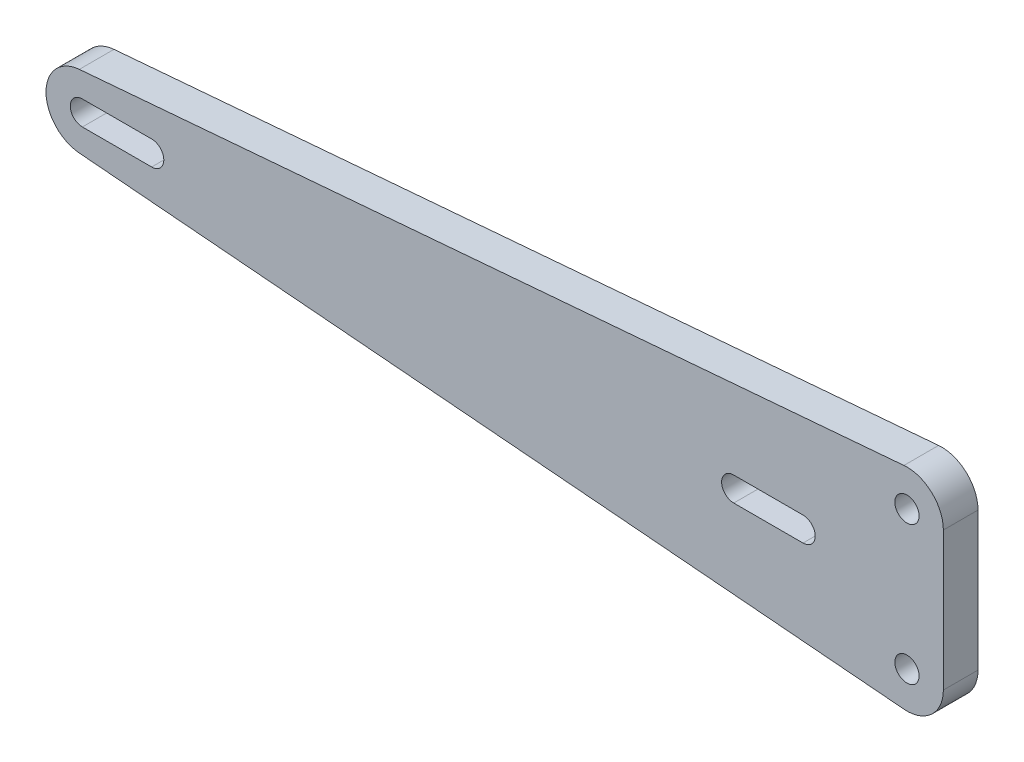
ISO-10303-21;
HEADER;
FILE_DESCRIPTION(('STEP AP214'),'2;1');
FILE_NAME('part.step','',(''),(''),'','','');
FILE_SCHEMA(('AUTOMOTIVE_DESIGN { 1 0 10303 214 1 1 1 1 }'));
ENDSEC;
DATA;
#1=APPLICATION_CONTEXT('core data for automotive mechanical design processes');
#2=APPLICATION_PROTOCOL_DEFINITION('international standard','automotive_design',2000,#1);
#3=PRODUCT_CONTEXT('',#1,'mechanical');
#4=PRODUCT('Part','Part','',(#3));
#5=PRODUCT_RELATED_PRODUCT_CATEGORY('part','',(#4));
#6=PRODUCT_DEFINITION_FORMATION('','',#4);
#7=PRODUCT_DEFINITION_CONTEXT('part definition',#1,'design');
#8=PRODUCT_DEFINITION('design','',#6,#7);
#9=PRODUCT_DEFINITION_SHAPE('','',#8);
#10=(LENGTH_UNIT() NAMED_UNIT(*) SI_UNIT(.MILLI.,.METRE.));
#11=(NAMED_UNIT(*) PLANE_ANGLE_UNIT() SI_UNIT($,.RADIAN.));
#12=(NAMED_UNIT(*) SI_UNIT($,.STERADIAN.) SOLID_ANGLE_UNIT());
#13=UNCERTAINTY_MEASURE_WITH_UNIT(LENGTH_MEASURE(1.E-05),#10,'distance_accuracy_value','');
#14=(GEOMETRIC_REPRESENTATION_CONTEXT(3) GLOBAL_UNCERTAINTY_ASSIGNED_CONTEXT((#13)) GLOBAL_UNIT_ASSIGNED_CONTEXT((#10,
#11,#12)) REPRESENTATION_CONTEXT('',''));
#15=CARTESIAN_POINT('',(0.,0.,0.));
#16=DIRECTION('',(0.,0.,1.));
#17=DIRECTION('',(1.,0.,0.));
#18=AXIS2_PLACEMENT_3D('',#15,#16,#17);
#19=CARTESIAN_POINT('',(-57.,0.,5.));
#20=DIRECTION('',(0.,0.,1.));
#21=DIRECTION('',(1.,0.,0.));
#22=AXIS2_PLACEMENT_3D('',#19,#20,#21);
#23=PLANE('',#22);
#24=CARTESIAN_POINT('',(62.,-10.,5.));
#25=DIRECTION('',(0.,0.,1.));
#26=DIRECTION('',(1.,0.,0.));
#27=AXIS2_PLACEMENT_3D('',#24,#25,#26);
#28=CIRCLE('',#27,1.75);
#29=CARTESIAN_POINT('',(63.75,-10.,5.));
#30=VERTEX_POINT('',#29);
#31=EDGE_CURVE('E162',#30,#30,#28,.T.);
#32=ORIENTED_EDGE('',*,*,#31,.F.);
#33=EDGE_LOOP('',(#32));
#34=FACE_BOUND('',#33,.T.);
#35=CARTESIAN_POINT('',(-57.,0.,5.));
#36=DIRECTION('',(0.,0.,1.));
#37=DIRECTION('',(1.,0.,0.));
#38=AXIS2_PLACEMENT_3D('',#35,#36,#37);
#39=CIRCLE('',#38,5.25);
#40=CARTESIAN_POINT('',(-57.4396269558596,5.23156077472886,5.));
#41=VERTEX_POINT('',#40);
#42=CARTESIAN_POINT('',(-57.4396269558596,-5.23156077472886,5.));
#43=VERTEX_POINT('',#42);
#44=EDGE_CURVE('E203',#41,#43,#39,.T.);
#45=ORIENTED_EDGE('',*,*,#44,.T.);
#46=DIRECTION('',(0.996487766615021,-0.0837384677827749,0.));
#47=VECTOR('',#46,1.);
#48=CARTESIAN_POINT('',(-57.4396269558596,-5.23156077472886,5.));
#49=LINE('',#48,#47);
#50=CARTESIAN_POINT('',(61.5603730441404,-15.2315607747289,5.));
#51=VERTEX_POINT('',#50);
#52=EDGE_CURVE('E206',#43,#51,#49,.T.);
#53=ORIENTED_EDGE('',*,*,#52,.T.);
#54=CARTESIAN_POINT('',(62.,-10.,5.));
#55=DIRECTION('',(0.,0.,1.));
#56=DIRECTION('',(1.,0.,0.));
#57=AXIS2_PLACEMENT_3D('',#54,#55,#56);
#58=CIRCLE('',#57,5.25);
#59=CARTESIAN_POINT('',(67.25,-10.,5.));
#60=VERTEX_POINT('',#59);
#61=EDGE_CURVE('E209',#51,#60,#58,.T.);
#62=ORIENTED_EDGE('',*,*,#61,.T.);
#63=DIRECTION('',(0.,1.,0.));
#64=VECTOR('',#63,1.);
#65=CARTESIAN_POINT('',(67.25,10.,5.));
#66=LINE('',#65,#64);
#67=CARTESIAN_POINT('',(67.25,10.,5.));
#68=VERTEX_POINT('',#67);
#69=EDGE_CURVE('E211',#60,#68,#66,.T.);
#70=ORIENTED_EDGE('',*,*,#69,.T.);
#71=CARTESIAN_POINT('',(62.,10.,5.));
#72=DIRECTION('',(0.,0.,1.));
#73=DIRECTION('',(1.,0.,0.));
#74=AXIS2_PLACEMENT_3D('',#71,#72,#73);
#75=CIRCLE('',#74,5.25000000000002);
#76=CARTESIAN_POINT('',(61.5603730441404,15.2315607747289,5.));
#77=VERTEX_POINT('',#76);
#78=EDGE_CURVE('E213',#68,#77,#75,.T.);
#79=ORIENTED_EDGE('',*,*,#78,.T.);
#80=DIRECTION('',(-0.996487766615021,-0.0837384677827752,0.));
#81=VECTOR('',#80,1.);
#82=CARTESIAN_POINT('',(-57.4396269558596,5.23156077472886,5.));
#83=LINE('',#82,#81);
#84=EDGE_CURVE('E215',#77,#41,#83,.T.);
#85=ORIENTED_EDGE('',*,*,#84,.T.);
#86=EDGE_LOOP('',(#45,#53,#62,#70,#79,#85));
#87=FACE_BOUND('',#86,.T.);
#88=DIRECTION('',(-1.,0.,0.));
#89=VECTOR('',#88,1.);
#90=CARTESIAN_POINT('',(47.,1.74999999999998,5.));
#91=LINE('',#90,#89);
#92=CARTESIAN_POINT('',(47.,1.74999999999998,5.));
#93=VERTEX_POINT('',#92);
#94=CARTESIAN_POINT('',(37.,1.74999999999998,5.));
#95=VERTEX_POINT('',#94);
#96=EDGE_CURVE('E174',#93,#95,#91,.T.);
#97=ORIENTED_EDGE('',*,*,#96,.F.);
#98=CARTESIAN_POINT('',(47.,0.,5.));
#99=DIRECTION('',(0.,0.,1.));
#100=DIRECTION('',(1.,0.,0.));
#101=AXIS2_PLACEMENT_3D('',#98,#99,#100);
#102=CIRCLE('',#101,1.74999999999998);
#103=CARTESIAN_POINT('',(47.,-1.74999999999998,5.));
#104=VERTEX_POINT('',#103);
#105=EDGE_CURVE('E172',#104,#93,#102,.T.);
#106=ORIENTED_EDGE('',*,*,#105,.F.);
#107=DIRECTION('',(1.,0.,0.));
#108=VECTOR('',#107,1.);
#109=CARTESIAN_POINT('',(47.,-1.74999999999998,5.));
#110=LINE('',#109,#108);
#111=CARTESIAN_POINT('',(37.,-1.74999999999998,5.));
#112=VERTEX_POINT('',#111);
#113=EDGE_CURVE('E180',#112,#104,#110,.T.);
#114=ORIENTED_EDGE('',*,*,#113,.F.);
#115=CARTESIAN_POINT('',(37.,0.,5.));
#116=DIRECTION('',(0.,0.,1.));
#117=DIRECTION('',(1.,0.,0.));
#118=AXIS2_PLACEMENT_3D('',#115,#116,#117);
#119=CIRCLE('',#118,1.74999999999998);
#120=EDGE_CURVE('E177',#95,#112,#119,.T.);
#121=ORIENTED_EDGE('',*,*,#120,.F.);
#122=EDGE_LOOP('',(#97,#106,#114,#121));
#123=FACE_BOUND('',#122,.T.);
#124=DIRECTION('',(-1.,0.,0.));
#125=VECTOR('',#124,1.);
#126=CARTESIAN_POINT('',(-47.,1.74999999999996,5.));
#127=LINE('',#126,#125);
#128=CARTESIAN_POINT('',(-47.,1.74999999999996,5.));
#129=VERTEX_POINT('',#128);
#130=CARTESIAN_POINT('',(-57.,1.74999999999999,5.));
#131=VERTEX_POINT('',#130);
#132=EDGE_CURVE('E141',#129,#131,#127,.T.);
#133=ORIENTED_EDGE('',*,*,#132,.F.);
#134=CARTESIAN_POINT('',(-47.,0.,5.));
#135=DIRECTION('',(0.,0.,1.));
#136=DIRECTION('',(1.,0.,0.));
#137=AXIS2_PLACEMENT_3D('',#134,#135,#136);
#138=CIRCLE('',#137,1.74999999999998);
#139=CARTESIAN_POINT('',(-47.,-1.74999999999999,5.));
#140=VERTEX_POINT('',#139);
#141=EDGE_CURVE('E133',#140,#129,#138,.T.);
#142=ORIENTED_EDGE('',*,*,#141,.F.);
#143=DIRECTION('',(1.,0.,0.));
#144=VECTOR('',#143,1.);
#145=CARTESIAN_POINT('',(-47.,-1.74999999999999,5.));
#146=LINE('',#145,#144);
#147=CARTESIAN_POINT('',(-57.,-1.74999999999999,5.));
#148=VERTEX_POINT('',#147);
#149=EDGE_CURVE('E156',#148,#140,#146,.T.);
#150=ORIENTED_EDGE('',*,*,#149,.F.);
#151=CARTESIAN_POINT('',(-57.,0.,5.));
#152=DIRECTION('',(0.,0.,1.));
#153=DIRECTION('',(1.,0.,0.));
#154=AXIS2_PLACEMENT_3D('',#151,#152,#153);
#155=CIRCLE('',#154,1.74999999999999);
#156=EDGE_CURVE('E154',#131,#148,#155,.T.);
#157=ORIENTED_EDGE('',*,*,#156,.F.);
#158=EDGE_LOOP('',(#133,#142,#150,#157));
#159=FACE_BOUND('',#158,.T.);
#160=CARTESIAN_POINT('',(62.,10.,5.));
#161=DIRECTION('',(0.,0.,1.));
#162=DIRECTION('',(-1.,0.,0.));
#163=AXIS2_PLACEMENT_3D('',#160,#161,#162);
#164=CIRCLE('',#163,1.75);
#165=CARTESIAN_POINT('',(60.25,10.,5.));
#166=VERTEX_POINT('',#165);
#167=EDGE_CURVE('E327',#166,#166,#164,.T.);
#168=ORIENTED_EDGE('',*,*,#167,.F.);
#169=EDGE_LOOP('',(#168));
#170=FACE_BOUND('',#169,.T.);
#171=ADVANCED_FACE('F32',(#34,#87,#123,#159,#170),#23,.T.);
#172=CARTESIAN_POINT('',(-57.,0.,0.));
#173=DIRECTION('',(0.,0.,1.));
#174=DIRECTION('',(1.,0.,0.));
#175=AXIS2_PLACEMENT_3D('',#172,#173,#174);
#176=PLANE('',#175);
#177=CARTESIAN_POINT('',(47.,0.,0.));
#178=DIRECTION('',(0.,0.,1.));
#179=DIRECTION('',(1.,0.,0.));
#180=AXIS2_PLACEMENT_3D('',#177,#178,#179);
#181=CIRCLE('',#180,1.74999999999998);
#182=CARTESIAN_POINT('',(47.,-1.74999999999998,0.));
#183=VERTEX_POINT('',#182);
#184=CARTESIAN_POINT('',(47.,1.74999999999998,0.));
#185=VERTEX_POINT('',#184);
#186=EDGE_CURVE('E149',#183,#185,#181,.T.);
#187=ORIENTED_EDGE('',*,*,#186,.T.);
#188=DIRECTION('',(-1.,0.,0.));
#189=VECTOR('',#188,1.);
#190=CARTESIAN_POINT('',(47.,1.74999999999998,0.));
#191=LINE('',#190,#189);
#192=CARTESIAN_POINT('',(37.,1.74999999999998,0.));
#193=VERTEX_POINT('',#192);
#194=EDGE_CURVE('E185',#185,#193,#191,.T.);
#195=ORIENTED_EDGE('',*,*,#194,.T.);
#196=CARTESIAN_POINT('',(37.,0.,0.));
#197=DIRECTION('',(0.,0.,1.));
#198=DIRECTION('',(1.,0.,0.));
#199=AXIS2_PLACEMENT_3D('',#196,#197,#198);
#200=CIRCLE('',#199,1.74999999999998);
#201=CARTESIAN_POINT('',(37.,-1.74999999999998,0.));
#202=VERTEX_POINT('',#201);
#203=EDGE_CURVE('E188',#193,#202,#200,.T.);
#204=ORIENTED_EDGE('',*,*,#203,.T.);
#205=DIRECTION('',(1.,0.,0.));
#206=VECTOR('',#205,1.);
#207=CARTESIAN_POINT('',(47.,-1.74999999999998,0.));
#208=LINE('',#207,#206);
#209=EDGE_CURVE('E175',#202,#183,#208,.T.);
#210=ORIENTED_EDGE('',*,*,#209,.T.);
#211=EDGE_LOOP('',(#187,#195,#204,#210));
#212=FACE_BOUND('',#211,.T.);
#213=CARTESIAN_POINT('',(-57.,0.,0.));
#214=DIRECTION('',(0.,0.,1.));
#215=DIRECTION('',(1.,0.,0.));
#216=AXIS2_PLACEMENT_3D('',#213,#214,#215);
#217=CIRCLE('',#216,5.25);
#218=CARTESIAN_POINT('',(-57.4396269558596,5.23156077472886,0.));
#219=VERTEX_POINT('',#218);
#220=CARTESIAN_POINT('',(-57.4396269558596,-5.23156077472886,0.));
#221=VERTEX_POINT('',#220);
#222=EDGE_CURVE('E202',#219,#221,#217,.T.);
#223=ORIENTED_EDGE('',*,*,#222,.F.);
#224=DIRECTION('',(-0.996487766615021,-0.0837384677827752,0.));
#225=VECTOR('',#224,1.);
#226=CARTESIAN_POINT('',(-57.4396269558596,5.23156077472886,0.));
#227=LINE('',#226,#225);
#228=CARTESIAN_POINT('',(61.5603730441404,15.2315607747289,0.));
#229=VERTEX_POINT('',#228);
#230=EDGE_CURVE('E207',#229,#219,#227,.T.);
#231=ORIENTED_EDGE('',*,*,#230,.F.);
#232=CARTESIAN_POINT('',(62.,10.,0.));
#233=DIRECTION('',(0.,0.,1.));
#234=DIRECTION('',(1.,0.,0.));
#235=AXIS2_PLACEMENT_3D('',#232,#233,#234);
#236=CIRCLE('',#235,5.25000000000002);
#237=CARTESIAN_POINT('',(67.25,10.,0.));
#238=VERTEX_POINT('',#237);
#239=EDGE_CURVE('E226',#238,#229,#236,.T.);
#240=ORIENTED_EDGE('',*,*,#239,.F.);
#241=DIRECTION('',(0.,1.,0.));
#242=VECTOR('',#241,1.);
#243=CARTESIAN_POINT('',(67.25,10.,0.));
#244=LINE('',#243,#242);
#245=CARTESIAN_POINT('',(67.25,-10.,0.));
#246=VERTEX_POINT('',#245);
#247=EDGE_CURVE('E224',#246,#238,#244,.T.);
#248=ORIENTED_EDGE('',*,*,#247,.F.);
#249=CARTESIAN_POINT('',(62.,-10.,0.));
#250=DIRECTION('',(0.,0.,1.));
#251=DIRECTION('',(1.,0.,0.));
#252=AXIS2_PLACEMENT_3D('',#249,#250,#251);
#253=CIRCLE('',#252,5.25);
#254=CARTESIAN_POINT('',(61.5603730441404,-15.2315607747289,0.));
#255=VERTEX_POINT('',#254);
#256=EDGE_CURVE('E222',#255,#246,#253,.T.);
#257=ORIENTED_EDGE('',*,*,#256,.F.);
#258=DIRECTION('',(0.996487766615021,-0.0837384677827749,0.));
#259=VECTOR('',#258,1.);
#260=CARTESIAN_POINT('',(-57.4396269558596,-5.23156077472886,0.));
#261=LINE('',#260,#259);
#262=EDGE_CURVE('E220',#221,#255,#261,.T.);
#263=ORIENTED_EDGE('',*,*,#262,.F.);
#264=EDGE_LOOP('',(#223,#231,#240,#248,#257,#263));
#265=FACE_BOUND('',#264,.T.);
#266=CARTESIAN_POINT('',(-47.,0.,0.));
#267=DIRECTION('',(0.,0.,1.));
#268=DIRECTION('',(1.,0.,0.));
#269=AXIS2_PLACEMENT_3D('',#266,#267,#268);
#270=CIRCLE('',#269,1.74999999999998);
#271=CARTESIAN_POINT('',(-47.,-1.74999999999999,0.));
#272=VERTEX_POINT('',#271);
#273=CARTESIAN_POINT('',(-47.,1.74999999999996,0.));
#274=VERTEX_POINT('',#273);
#275=EDGE_CURVE('E55',#272,#274,#270,.T.);
#276=ORIENTED_EDGE('',*,*,#275,.T.);
#277=DIRECTION('',(-1.,0.,0.));
#278=VECTOR('',#277,1.);
#279=CARTESIAN_POINT('',(-47.,1.74999999999996,0.));
#280=LINE('',#279,#278);
#281=CARTESIAN_POINT('',(-57.,1.74999999999999,0.));
#282=VERTEX_POINT('',#281);
#283=EDGE_CURVE('E148',#274,#282,#280,.T.);
#284=ORIENTED_EDGE('',*,*,#283,.T.);
#285=CARTESIAN_POINT('',(-57.,0.,0.));
#286=DIRECTION('',(0.,0.,1.));
#287=DIRECTION('',(1.,0.,0.));
#288=AXIS2_PLACEMENT_3D('',#285,#286,#287);
#289=CIRCLE('',#288,1.74999999999999);
#290=CARTESIAN_POINT('',(-57.,-1.74999999999999,0.));
#291=VERTEX_POINT('',#290);
#292=EDGE_CURVE('E164',#282,#291,#289,.T.);
#293=ORIENTED_EDGE('',*,*,#292,.T.);
#294=DIRECTION('',(1.,0.,0.));
#295=VECTOR('',#294,1.);
#296=CARTESIAN_POINT('',(-47.,-1.74999999999999,0.));
#297=LINE('',#296,#295);
#298=EDGE_CURVE('E142',#291,#272,#297,.T.);
#299=ORIENTED_EDGE('',*,*,#298,.T.);
#300=EDGE_LOOP('',(#276,#284,#293,#299));
#301=FACE_BOUND('',#300,.T.);
#302=CARTESIAN_POINT('',(62.,-10.,0.));
#303=DIRECTION('',(0.,0.,1.));
#304=DIRECTION('',(1.,0.,0.));
#305=AXIS2_PLACEMENT_3D('',#302,#303,#304);
#306=CIRCLE('',#305,1.75);
#307=CARTESIAN_POINT('',(63.75,-10.,0.));
#308=VERTEX_POINT('',#307);
#309=EDGE_CURVE('E333',#308,#308,#306,.T.);
#310=ORIENTED_EDGE('',*,*,#309,.T.);
#311=EDGE_LOOP('',(#310));
#312=FACE_BOUND('',#311,.T.);
#313=CARTESIAN_POINT('',(62.,10.,0.));
#314=DIRECTION('',(0.,0.,1.));
#315=DIRECTION('',(-1.,0.,0.));
#316=AXIS2_PLACEMENT_3D('',#313,#314,#315);
#317=CIRCLE('',#316,1.75);
#318=CARTESIAN_POINT('',(60.25,10.,0.));
#319=VERTEX_POINT('',#318);
#320=EDGE_CURVE('E330',#319,#319,#317,.T.);
#321=ORIENTED_EDGE('',*,*,#320,.T.);
#322=EDGE_LOOP('',(#321));
#323=FACE_BOUND('',#322,.T.);
#324=ADVANCED_FACE('F250',(#212,#265,#301,#312,#323),#176,.F.);
#325=CARTESIAN_POINT('',(-57.,0.,5.));
#326=DIRECTION('',(0.,0.,-1.));
#327=DIRECTION('',(-1.,0.,0.));
#328=AXIS2_PLACEMENT_3D('',#325,#326,#327);
#329=CYLINDRICAL_SURFACE('',#328,5.25);
#330=ORIENTED_EDGE('',*,*,#222,.T.);
#331=DIRECTION('',(0.,0.,-1.));
#332=VECTOR('',#331,1.);
#333=CARTESIAN_POINT('',(-57.4396269558596,-5.23156077472886,5.));
#334=LINE('',#333,#332);
#335=EDGE_CURVE('E11',#43,#221,#334,.T.);
#336=ORIENTED_EDGE('',*,*,#335,.F.);
#337=ORIENTED_EDGE('',*,*,#44,.F.);
#338=DIRECTION('',(0.,0.,-1.));
#339=VECTOR('',#338,1.);
#340=CARTESIAN_POINT('',(-57.4396269558596,5.23156077472886,5.));
#341=LINE('',#340,#339);
#342=EDGE_CURVE('E217',#41,#219,#341,.T.);
#343=ORIENTED_EDGE('',*,*,#342,.T.);
#344=EDGE_LOOP('',(#330,#336,#337,#343));
#345=FACE_BOUND('',#344,.T.);
#346=ADVANCED_FACE('F34',(#345),#329,.T.);
#347=CARTESIAN_POINT('',(-57.4396269558596,-5.23156077472886,5.));
#348=DIRECTION('',(0.0837384677827749,0.996487766615021,0.));
#349=DIRECTION('',(-0.996487766615021,0.0837384677827749,0.));
#350=AXIS2_PLACEMENT_3D('',#347,#348,#349);
#351=PLANE('',#350);
#352=ORIENTED_EDGE('',*,*,#262,.T.);
#353=DIRECTION('',(0.,0.,-1.));
#354=VECTOR('',#353,1.);
#355=CARTESIAN_POINT('',(61.5603730441404,-15.2315607747289,5.));
#356=LINE('',#355,#354);
#357=EDGE_CURVE('E40',#51,#255,#356,.T.);
#358=ORIENTED_EDGE('',*,*,#357,.F.);
#359=ORIENTED_EDGE('',*,*,#52,.F.);
#360=ORIENTED_EDGE('',*,*,#335,.T.);
#361=EDGE_LOOP('',(#352,#358,#359,#360));
#362=FACE_BOUND('',#361,.T.);
#363=ADVANCED_FACE('F268',(#362),#351,.F.);
#364=CARTESIAN_POINT('',(62.,-10.,5.));
#365=DIRECTION('',(0.,0.,-1.));
#366=DIRECTION('',(-1.,0.,0.));
#367=AXIS2_PLACEMENT_3D('',#364,#365,#366);
#368=CYLINDRICAL_SURFACE('',#367,5.25);
#369=ORIENTED_EDGE('',*,*,#256,.T.);
#370=DIRECTION('',(0.,0.,-1.));
#371=VECTOR('',#370,1.);
#372=CARTESIAN_POINT('',(67.25,-10.,5.));
#373=LINE('',#372,#371);
#374=EDGE_CURVE('E237',#60,#246,#373,.T.);
#375=ORIENTED_EDGE('',*,*,#374,.F.);
#376=ORIENTED_EDGE('',*,*,#61,.F.);
#377=ORIENTED_EDGE('',*,*,#357,.T.);
#378=EDGE_LOOP('',(#369,#375,#376,#377));
#379=FACE_BOUND('',#378,.T.);
#380=ADVANCED_FACE('F244',(#379),#368,.T.);
#381=CARTESIAN_POINT('',(67.25,10.,5.));
#382=DIRECTION('',(-1.,0.,0.));
#383=DIRECTION('',(0.,0.,1.));
#384=AXIS2_PLACEMENT_3D('',#381,#382,#383);
#385=PLANE('',#384);
#386=ORIENTED_EDGE('',*,*,#247,.T.);
#387=DIRECTION('',(0.,0.,-1.));
#388=VECTOR('',#387,1.);
#389=CARTESIAN_POINT('',(67.25,10.,5.));
#390=LINE('',#389,#388);
#391=EDGE_CURVE('E234',#68,#238,#390,.T.);
#392=ORIENTED_EDGE('',*,*,#391,.F.);
#393=ORIENTED_EDGE('',*,*,#69,.F.);
#394=ORIENTED_EDGE('',*,*,#374,.T.);
#395=EDGE_LOOP('',(#386,#392,#393,#394));
#396=FACE_BOUND('',#395,.T.);
#397=ADVANCED_FACE('F256',(#396),#385,.F.);
#398=CARTESIAN_POINT('',(62.,10.,5.));
#399=DIRECTION('',(0.,0.,-1.));
#400=DIRECTION('',(-1.,0.,0.));
#401=AXIS2_PLACEMENT_3D('',#398,#399,#400);
#402=CYLINDRICAL_SURFACE('',#401,5.25000000000002);
#403=ORIENTED_EDGE('',*,*,#239,.T.);
#404=DIRECTION('',(0.,0.,-1.));
#405=VECTOR('',#404,1.);
#406=CARTESIAN_POINT('',(61.5603730441404,15.2315607747289,5.));
#407=LINE('',#406,#405);
#408=EDGE_CURVE('E231',#77,#229,#407,.T.);
#409=ORIENTED_EDGE('',*,*,#408,.F.);
#410=ORIENTED_EDGE('',*,*,#78,.F.);
#411=ORIENTED_EDGE('',*,*,#391,.T.);
#412=EDGE_LOOP('',(#403,#409,#410,#411));
#413=FACE_BOUND('',#412,.T.);
#414=ADVANCED_FACE('F260',(#413),#402,.T.);
#415=CARTESIAN_POINT('',(-57.4396269558596,5.23156077472886,5.));
#416=DIRECTION('',(0.0837384677827752,-0.996487766615021,0.));
#417=DIRECTION('',(0.996487766615021,0.0837384677827752,0.));
#418=AXIS2_PLACEMENT_3D('',#415,#416,#417);
#419=PLANE('',#418);
#420=ORIENTED_EDGE('',*,*,#230,.T.);
#421=ORIENTED_EDGE('',*,*,#342,.F.);
#422=ORIENTED_EDGE('',*,*,#84,.F.);
#423=ORIENTED_EDGE('',*,*,#408,.T.);
#424=EDGE_LOOP('',(#420,#421,#422,#423));
#425=FACE_BOUND('',#424,.T.);
#426=ADVANCED_FACE('F271',(#425),#419,.F.);
#427=CARTESIAN_POINT('',(47.,0.,5.));
#428=DIRECTION('',(0.,0.,-1.));
#429=DIRECTION('',(-1.,0.,0.));
#430=AXIS2_PLACEMENT_3D('',#427,#428,#429);
#431=CYLINDRICAL_SURFACE('',#430,1.74999999999998);
#432=ORIENTED_EDGE('',*,*,#186,.F.);
#433=DIRECTION('',(0.,0.,-1.));
#434=VECTOR('',#433,1.);
#435=CARTESIAN_POINT('',(47.,-1.74999999999998,5.));
#436=LINE('',#435,#434);
#437=EDGE_CURVE('E182',#104,#183,#436,.T.);
#438=ORIENTED_EDGE('',*,*,#437,.F.);
#439=ORIENTED_EDGE('',*,*,#105,.T.);
#440=DIRECTION('',(0.,0.,-1.));
#441=VECTOR('',#440,1.);
#442=CARTESIAN_POINT('',(47.,1.74999999999998,5.));
#443=LINE('',#442,#441);
#444=EDGE_CURVE('E199',#93,#185,#443,.T.);
#445=ORIENTED_EDGE('',*,*,#444,.T.);
#446=EDGE_LOOP('',(#432,#438,#439,#445));
#447=FACE_BOUND('',#446,.T.);
#448=ADVANCED_FACE('F273',(#447),#431,.F.);
#449=CARTESIAN_POINT('',(47.,1.74999999999998,5.));
#450=DIRECTION('',(0.,-1.,0.));
#451=DIRECTION('',(1.,0.,0.));
#452=AXIS2_PLACEMENT_3D('',#449,#450,#451);
#453=PLANE('',#452);
#454=ORIENTED_EDGE('',*,*,#194,.F.);
#455=ORIENTED_EDGE('',*,*,#444,.F.);
#456=ORIENTED_EDGE('',*,*,#96,.T.);
#457=DIRECTION('',(0.,0.,-1.));
#458=VECTOR('',#457,1.);
#459=CARTESIAN_POINT('',(37.,1.74999999999998,5.));
#460=LINE('',#459,#458);
#461=EDGE_CURVE('E197',#95,#193,#460,.T.);
#462=ORIENTED_EDGE('',*,*,#461,.T.);
#463=EDGE_LOOP('',(#454,#455,#456,#462));
#464=FACE_BOUND('',#463,.T.);
#465=ADVANCED_FACE('F279',(#464),#453,.T.);
#466=CARTESIAN_POINT('',(37.,0.,5.));
#467=DIRECTION('',(0.,0.,-1.));
#468=DIRECTION('',(-1.,0.,0.));
#469=AXIS2_PLACEMENT_3D('',#466,#467,#468);
#470=CYLINDRICAL_SURFACE('',#469,1.74999999999998);
#471=ORIENTED_EDGE('',*,*,#203,.F.);
#472=ORIENTED_EDGE('',*,*,#461,.F.);
#473=ORIENTED_EDGE('',*,*,#120,.T.);
#474=DIRECTION('',(0.,0.,-1.));
#475=VECTOR('',#474,1.);
#476=CARTESIAN_POINT('',(37.,-1.74999999999998,5.));
#477=LINE('',#476,#475);
#478=EDGE_CURVE('E195',#112,#202,#477,.T.);
#479=ORIENTED_EDGE('',*,*,#478,.T.);
#480=EDGE_LOOP('',(#471,#472,#473,#479));
#481=FACE_BOUND('',#480,.T.);
#482=ADVANCED_FACE('F295',(#481),#470,.F.);
#483=CARTESIAN_POINT('',(47.,-1.74999999999998,5.));
#484=DIRECTION('',(0.,1.,0.));
#485=DIRECTION('',(-1.,0.,0.));
#486=AXIS2_PLACEMENT_3D('',#483,#484,#485);
#487=PLANE('',#486);
#488=ORIENTED_EDGE('',*,*,#209,.F.);
#489=ORIENTED_EDGE('',*,*,#478,.F.);
#490=ORIENTED_EDGE('',*,*,#113,.T.);
#491=ORIENTED_EDGE('',*,*,#437,.T.);
#492=EDGE_LOOP('',(#488,#489,#490,#491));
#493=FACE_BOUND('',#492,.T.);
#494=ADVANCED_FACE('F299',(#493),#487,.T.);
#495=CARTESIAN_POINT('',(-47.,0.,5.));
#496=DIRECTION('',(0.,0.,-1.));
#497=DIRECTION('',(-1.,0.,0.));
#498=AXIS2_PLACEMENT_3D('',#495,#496,#497);
#499=CYLINDRICAL_SURFACE('',#498,1.74999999999998);
#500=ORIENTED_EDGE('',*,*,#275,.F.);
#501=DIRECTION('',(0.,0.,-1.));
#502=VECTOR('',#501,1.);
#503=CARTESIAN_POINT('',(-47.,-1.74999999999999,5.));
#504=LINE('',#503,#502);
#505=EDGE_CURVE('E137',#140,#272,#504,.T.);
#506=ORIENTED_EDGE('',*,*,#505,.F.);
#507=ORIENTED_EDGE('',*,*,#141,.T.);
#508=DIRECTION('',(0.,0.,-1.));
#509=VECTOR('',#508,1.);
#510=CARTESIAN_POINT('',(-47.,1.74999999999996,5.));
#511=LINE('',#510,#509);
#512=EDGE_CURVE('E136',#129,#274,#511,.T.);
#513=ORIENTED_EDGE('',*,*,#512,.T.);
#514=EDGE_LOOP('',(#500,#506,#507,#513));
#515=FACE_BOUND('',#514,.T.);
#516=ADVANCED_FACE('F135',(#515),#499,.F.);
#517=CARTESIAN_POINT('',(-47.,1.74999999999996,5.));
#518=DIRECTION('',(0.,-1.,0.));
#519=DIRECTION('',(1.,0.,0.));
#520=AXIS2_PLACEMENT_3D('',#517,#518,#519);
#521=PLANE('',#520);
#522=ORIENTED_EDGE('',*,*,#283,.F.);
#523=ORIENTED_EDGE('',*,*,#512,.F.);
#524=ORIENTED_EDGE('',*,*,#132,.T.);
#525=DIRECTION('',(0.,0.,-1.));
#526=VECTOR('',#525,1.);
#527=CARTESIAN_POINT('',(-57.,1.74999999999999,5.));
#528=LINE('',#527,#526);
#529=EDGE_CURVE('E150',#131,#282,#528,.T.);
#530=ORIENTED_EDGE('',*,*,#529,.T.);
#531=EDGE_LOOP('',(#522,#523,#524,#530));
#532=FACE_BOUND('',#531,.T.);
#533=ADVANCED_FACE('F145',(#532),#521,.T.);
#534=CARTESIAN_POINT('',(-57.,0.,5.));
#535=DIRECTION('',(0.,0.,-1.));
#536=DIRECTION('',(-1.,0.,0.));
#537=AXIS2_PLACEMENT_3D('',#534,#535,#536);
#538=CYLINDRICAL_SURFACE('',#537,1.74999999999999);
#539=ORIENTED_EDGE('',*,*,#292,.F.);
#540=ORIENTED_EDGE('',*,*,#529,.F.);
#541=ORIENTED_EDGE('',*,*,#156,.T.);
#542=DIRECTION('',(0.,0.,-1.));
#543=VECTOR('',#542,1.);
#544=CARTESIAN_POINT('',(-57.,-1.74999999999999,5.));
#545=LINE('',#544,#543);
#546=EDGE_CURVE('E47',#148,#291,#545,.T.);
#547=ORIENTED_EDGE('',*,*,#546,.T.);
#548=EDGE_LOOP('',(#539,#540,#541,#547));
#549=FACE_BOUND('',#548,.T.);
#550=ADVANCED_FACE('F308',(#549),#538,.F.);
#551=CARTESIAN_POINT('',(-47.,-1.74999999999999,5.));
#552=DIRECTION('',(0.,1.,0.));
#553=DIRECTION('',(-1.,0.,0.));
#554=AXIS2_PLACEMENT_3D('',#551,#552,#553);
#555=PLANE('',#554);
#556=ORIENTED_EDGE('',*,*,#298,.F.);
#557=ORIENTED_EDGE('',*,*,#546,.F.);
#558=ORIENTED_EDGE('',*,*,#149,.T.);
#559=ORIENTED_EDGE('',*,*,#505,.T.);
#560=EDGE_LOOP('',(#556,#557,#558,#559));
#561=FACE_BOUND('',#560,.T.);
#562=ADVANCED_FACE('F311',(#561),#555,.T.);
#563=CARTESIAN_POINT('',(62.,-10.,5.));
#564=DIRECTION('',(0.,0.,-1.));
#565=DIRECTION('',(-1.,0.,0.));
#566=AXIS2_PLACEMENT_3D('',#563,#564,#565);
#567=CYLINDRICAL_SURFACE('',#566,1.75);
#568=ORIENTED_EDGE('',*,*,#31,.T.);
#569=EDGE_LOOP('',(#568));
#570=FACE_BOUND('',#569,.T.);
#571=ORIENTED_EDGE('',*,*,#309,.F.);
#572=EDGE_LOOP('',(#571));
#573=FACE_BOUND('',#572,.T.);
#574=ADVANCED_FACE('F315',(#570,#573),#567,.F.);
#575=CARTESIAN_POINT('',(62.,10.,5.));
#576=DIRECTION('',(0.,0.,-1.));
#577=DIRECTION('',(-1.,0.,0.));
#578=AXIS2_PLACEMENT_3D('',#575,#576,#577);
#579=CYLINDRICAL_SURFACE('',#578,1.75);
#580=ORIENTED_EDGE('',*,*,#167,.T.);
#581=EDGE_LOOP('',(#580));
#582=FACE_BOUND('',#581,.T.);
#583=ORIENTED_EDGE('',*,*,#320,.F.);
#584=EDGE_LOOP('',(#583));
#585=FACE_BOUND('',#584,.T.);
#586=ADVANCED_FACE('F318',(#582,#585),#579,.F.);
#587=CLOSED_SHELL('',(#171,#324,#346,#363,#380,#397,#414,#426,#448,#465,#482,#494,#516,#533,
#550,#562,#574,#586));
#588=MANIFOLD_SOLID_BREP('B2',#587);
#589=ADVANCED_BREP_SHAPE_REPRESENTATION('',(#18,#588),#14);
#590=SHAPE_DEFINITION_REPRESENTATION(#9,#589);
ENDSEC;
END-ISO-10303-21;
